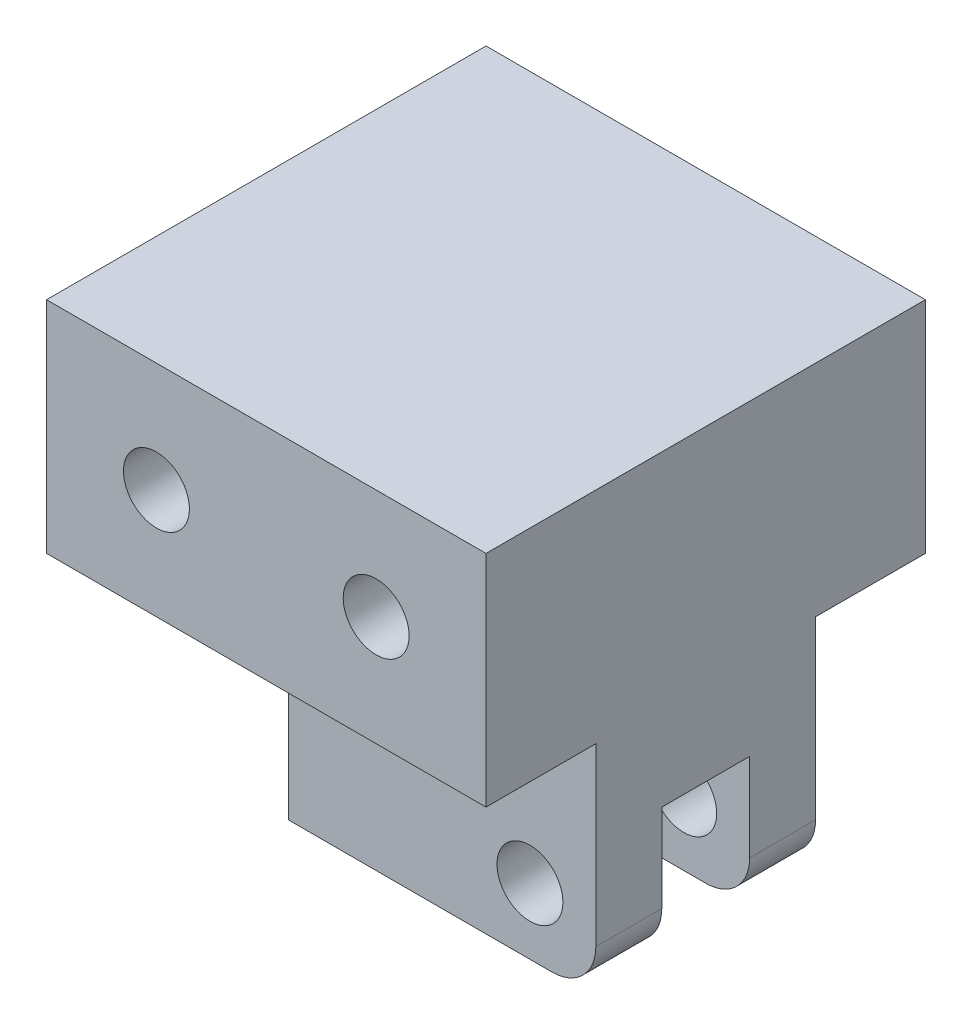
ISO-10303-21;
HEADER;
FILE_DESCRIPTION(('STEP AP214'),'2;1');
FILE_NAME('part.step','',(''),(''),'','','');
FILE_SCHEMA(('AUTOMOTIVE_DESIGN { 1 0 10303 214 1 1 1 1 }'));
ENDSEC;
DATA;
#1=APPLICATION_CONTEXT('core data for automotive mechanical design processes');
#2=APPLICATION_PROTOCOL_DEFINITION('international standard','automotive_design',2000,#1);
#3=PRODUCT_CONTEXT('',#1,'mechanical');
#4=PRODUCT('Part','Part','',(#3));
#5=PRODUCT_RELATED_PRODUCT_CATEGORY('part','',(#4));
#6=PRODUCT_DEFINITION_FORMATION('','',#4);
#7=PRODUCT_DEFINITION_CONTEXT('part definition',#1,'design');
#8=PRODUCT_DEFINITION('design','',#6,#7);
#9=PRODUCT_DEFINITION_SHAPE('','',#8);
#10=(LENGTH_UNIT() NAMED_UNIT(*) SI_UNIT(.MILLI.,.METRE.));
#11=(NAMED_UNIT(*) PLANE_ANGLE_UNIT() SI_UNIT($,.RADIAN.));
#12=(NAMED_UNIT(*) SI_UNIT($,.STERADIAN.) SOLID_ANGLE_UNIT());
#13=UNCERTAINTY_MEASURE_WITH_UNIT(LENGTH_MEASURE(1.E-05),#10,'distance_accuracy_value','');
#14=(GEOMETRIC_REPRESENTATION_CONTEXT(3) GLOBAL_UNCERTAINTY_ASSIGNED_CONTEXT((#13)) GLOBAL_UNIT_ASSIGNED_CONTEXT((#10,
#11,#12)) REPRESENTATION_CONTEXT('',''));
#15=CARTESIAN_POINT('',(0.,0.,0.));
#16=DIRECTION('',(0.,0.,1.));
#17=DIRECTION('',(1.,0.,0.));
#18=AXIS2_PLACEMENT_3D('',#15,#16,#17);
#19=CARTESIAN_POINT('',(85.,-35.,0.));
#20=DIRECTION('',(0.,0.,1.));
#21=DIRECTION('',(1.,0.,0.));
#22=AXIS2_PLACEMENT_3D('',#19,#20,#21);
#23=CYLINDRICAL_SURFACE('',#22,7.50000000000001);
#24=CARTESIAN_POINT('',(85.,-35.,40.));
#25=DIRECTION('',(0.,0.,-1.));
#26=DIRECTION('',(-1.,0.,0.));
#27=AXIS2_PLACEMENT_3D('',#24,#25,#26);
#28=CIRCLE('',#27,7.50000000000001);
#29=CARTESIAN_POINT('',(77.5,-35.,40.));
#30=VERTEX_POINT('',#29);
#31=EDGE_CURVE('E192',#30,#30,#28,.F.);
#32=ORIENTED_EDGE('',*,*,#31,.T.);
#33=EDGE_LOOP('',(#32));
#34=FACE_BOUND('',#33,.T.);
#35=CARTESIAN_POINT('',(85.,-35.,25.));
#36=DIRECTION('',(0.,0.,1.));
#37=DIRECTION('',(1.,0.,0.));
#38=AXIS2_PLACEMENT_3D('',#35,#36,#37);
#39=CIRCLE('',#38,7.50000000000001);
#40=CARTESIAN_POINT('',(92.5,-35.,25.));
#41=VERTEX_POINT('',#40);
#42=EDGE_CURVE('E191',#41,#41,#39,.T.);
#43=ORIENTED_EDGE('',*,*,#42,.F.);
#44=EDGE_LOOP('',(#43));
#45=FACE_BOUND('',#44,.T.);
#46=ADVANCED_FACE('F45',(#34,#45),#23,.F.);
#47=CARTESIAN_POINT('',(100.,0.,0.));
#48=DIRECTION('',(0.,1.,0.));
#49=DIRECTION('',(0.,0.,1.));
#50=AXIS2_PLACEMENT_3D('',#47,#48,#49);
#51=PLANE('',#50);
#52=DIRECTION('',(1.,0.,0.));
#53=VECTOR('',#52,1.);
#54=CARTESIAN_POINT('',(100.,0.,25.));
#55=LINE('',#54,#53);
#56=CARTESIAN_POINT('',(30.,0.,25.));
#57=VERTEX_POINT('',#56);
#58=CARTESIAN_POINT('',(100.,0.,25.));
#59=VERTEX_POINT('',#58);
#60=EDGE_CURVE('E197',#57,#59,#55,.T.);
#61=ORIENTED_EDGE('',*,*,#60,.F.);
#62=DIRECTION('',(0.,0.,-1.));
#63=VECTOR('',#62,1.);
#64=CARTESIAN_POINT('',(30.,0.,75.));
#65=LINE('',#64,#63);
#66=CARTESIAN_POINT('',(30.,0.,75.));
#67=VERTEX_POINT('',#66);
#68=EDGE_CURVE('E209',#67,#57,#65,.T.);
#69=ORIENTED_EDGE('',*,*,#68,.F.);
#70=DIRECTION('',(-1.,0.,0.));
#71=VECTOR('',#70,1.);
#72=CARTESIAN_POINT('',(100.,0.,75.));
#73=LINE('',#72,#71);
#74=CARTESIAN_POINT('',(100.,0.,75.));
#75=VERTEX_POINT('',#74);
#76=EDGE_CURVE('E205',#75,#67,#73,.T.);
#77=ORIENTED_EDGE('',*,*,#76,.F.);
#78=DIRECTION('',(0.,0.,-1.));
#79=VECTOR('',#78,1.);
#80=CARTESIAN_POINT('',(100.,0.,0.));
#81=LINE('',#80,#79);
#82=CARTESIAN_POINT('',(100.,0.,100.));
#83=VERTEX_POINT('',#82);
#84=EDGE_CURVE('E258',#83,#75,#81,.T.);
#85=ORIENTED_EDGE('',*,*,#84,.F.);
#86=DIRECTION('',(-1.,0.,0.));
#87=VECTOR('',#86,1.);
#88=CARTESIAN_POINT('',(100.,0.,100.));
#89=LINE('',#88,#87);
#90=CARTESIAN_POINT('',(0.,0.,100.));
#91=VERTEX_POINT('',#90);
#92=EDGE_CURVE('E277',#83,#91,#89,.T.);
#93=ORIENTED_EDGE('',*,*,#92,.T.);
#94=DIRECTION('',(0.,0.,-1.));
#95=VECTOR('',#94,1.);
#96=CARTESIAN_POINT('',(0.,0.,0.));
#97=LINE('',#96,#95);
#98=CARTESIAN_POINT('',(0.,0.,0.));
#99=VERTEX_POINT('',#98);
#100=EDGE_CURVE('E251',#91,#99,#97,.T.);
#101=ORIENTED_EDGE('',*,*,#100,.T.);
#102=DIRECTION('',(-1.,0.,0.));
#103=VECTOR('',#102,1.);
#104=CARTESIAN_POINT('',(100.,0.,0.));
#105=LINE('',#104,#103);
#106=CARTESIAN_POINT('',(100.,0.,0.));
#107=VERTEX_POINT('',#106);
#108=EDGE_CURVE('E262',#107,#99,#105,.T.);
#109=ORIENTED_EDGE('',*,*,#108,.F.);
#110=EDGE_CURVE('E257',#59,#107,#81,.T.);
#111=ORIENTED_EDGE('',*,*,#110,.F.);
#112=EDGE_LOOP('',(#61,#69,#77,#85,#93,#101,#109,#111));
#113=FACE_BOUND('',#112,.T.);
#114=ADVANCED_FACE('F364',(#113),#51,.F.);
#115=CARTESIAN_POINT('',(100.,0.,0.));
#116=DIRECTION('',(0.,0.,1.));
#117=DIRECTION('',(0.,-1.,0.));
#118=AXIS2_PLACEMENT_3D('',#115,#116,#117);
#119=PLANE('',#118);
#120=CARTESIAN_POINT('',(75.,25.,0.));
#121=DIRECTION('',(0.,0.,-1.));
#122=DIRECTION('',(0.,1.,0.));
#123=AXIS2_PLACEMENT_3D('',#120,#121,#122);
#124=CIRCLE('',#123,7.5);
#125=CARTESIAN_POINT('',(75.,32.5,0.));
#126=VERTEX_POINT('',#125);
#127=EDGE_CURVE('E235',#126,#126,#124,.T.);
#128=ORIENTED_EDGE('',*,*,#127,.F.);
#129=EDGE_LOOP('',(#128));
#130=FACE_BOUND('',#129,.T.);
#131=CARTESIAN_POINT('',(25.,25.,0.));
#132=DIRECTION('',(0.,0.,-1.));
#133=DIRECTION('',(0.,1.,0.));
#134=AXIS2_PLACEMENT_3D('',#131,#132,#133);
#135=CIRCLE('',#134,7.5);
#136=CARTESIAN_POINT('',(25.,32.5,0.));
#137=VERTEX_POINT('',#136);
#138=EDGE_CURVE('E239',#137,#137,#135,.T.);
#139=ORIENTED_EDGE('',*,*,#138,.F.);
#140=EDGE_LOOP('',(#139));
#141=FACE_BOUND('',#140,.T.);
#142=DIRECTION('',(0.,1.,0.));
#143=VECTOR('',#142,1.);
#144=CARTESIAN_POINT('',(0.,0.,0.));
#145=LINE('',#144,#143);
#146=CARTESIAN_POINT('',(0.,50.,0.));
#147=VERTEX_POINT('',#146);
#148=EDGE_CURVE('E234',#99,#147,#145,.T.);
#149=ORIENTED_EDGE('',*,*,#148,.T.);
#150=DIRECTION('',(-1.,0.,0.));
#151=VECTOR('',#150,1.);
#152=CARTESIAN_POINT('',(100.,50.,0.));
#153=LINE('',#152,#151);
#154=CARTESIAN_POINT('',(100.,50.,0.));
#155=VERTEX_POINT('',#154);
#156=EDGE_CURVE('E285',#155,#147,#153,.T.);
#157=ORIENTED_EDGE('',*,*,#156,.F.);
#158=DIRECTION('',(0.,1.,0.));
#159=VECTOR('',#158,1.);
#160=CARTESIAN_POINT('',(100.,0.,0.));
#161=LINE('',#160,#159);
#162=EDGE_CURVE('E246',#107,#155,#161,.T.);
#163=ORIENTED_EDGE('',*,*,#162,.F.);
#164=ORIENTED_EDGE('',*,*,#108,.T.);
#165=EDGE_LOOP('',(#149,#157,#163,#164));
#166=FACE_BOUND('',#165,.T.);
#167=ADVANCED_FACE('F373',(#130,#141,#166),#119,.F.);
#168=CARTESIAN_POINT('',(100.,50.,0.));
#169=DIRECTION('',(0.,-1.,0.));
#170=DIRECTION('',(0.,0.,-1.));
#171=AXIS2_PLACEMENT_3D('',#168,#169,#170);
#172=PLANE('',#171);
#173=DIRECTION('',(0.,0.,1.));
#174=VECTOR('',#173,1.);
#175=CARTESIAN_POINT('',(0.,50.,0.));
#176=LINE('',#175,#174);
#177=CARTESIAN_POINT('',(0.,50.,100.));
#178=VERTEX_POINT('',#177);
#179=EDGE_CURVE('E266',#147,#178,#176,.T.);
#180=ORIENTED_EDGE('',*,*,#179,.T.);
#181=DIRECTION('',(-1.,0.,0.));
#182=VECTOR('',#181,1.);
#183=CARTESIAN_POINT('',(100.,50.,100.));
#184=LINE('',#183,#182);
#185=CARTESIAN_POINT('',(100.,50.,100.));
#186=VERTEX_POINT('',#185);
#187=EDGE_CURVE('E281',#186,#178,#184,.T.);
#188=ORIENTED_EDGE('',*,*,#187,.F.);
#189=DIRECTION('',(0.,0.,1.));
#190=VECTOR('',#189,1.);
#191=CARTESIAN_POINT('',(100.,50.,0.));
#192=LINE('',#191,#190);
#193=EDGE_CURVE('E250',#155,#186,#192,.T.);
#194=ORIENTED_EDGE('',*,*,#193,.F.);
#195=ORIENTED_EDGE('',*,*,#156,.T.);
#196=EDGE_LOOP('',(#180,#188,#194,#195));
#197=FACE_BOUND('',#196,.T.);
#198=ADVANCED_FACE('F420',(#197),#172,.F.);
#199=CARTESIAN_POINT('',(100.,0.,100.));
#200=DIRECTION('',(0.,0.,-1.));
#201=DIRECTION('',(-1.,0.,0.));
#202=AXIS2_PLACEMENT_3D('',#199,#200,#201);
#203=PLANE('',#202);
#204=CARTESIAN_POINT('',(75.,25.,100.));
#205=DIRECTION('',(0.,0.,-1.));
#206=DIRECTION('',(0.,1.,0.));
#207=AXIS2_PLACEMENT_3D('',#204,#205,#206);
#208=CIRCLE('',#207,7.5);
#209=CARTESIAN_POINT('',(75.,32.5,100.));
#210=VERTEX_POINT('',#209);
#211=EDGE_CURVE('E230',#210,#210,#208,.T.);
#212=ORIENTED_EDGE('',*,*,#211,.T.);
#213=EDGE_LOOP('',(#212));
#214=FACE_BOUND('',#213,.T.);
#215=CARTESIAN_POINT('',(25.,25.,100.));
#216=DIRECTION('',(0.,0.,-1.));
#217=DIRECTION('',(0.,1.,0.));
#218=AXIS2_PLACEMENT_3D('',#215,#216,#217);
#219=CIRCLE('',#218,7.5);
#220=CARTESIAN_POINT('',(25.,32.5,100.));
#221=VERTEX_POINT('',#220);
#222=EDGE_CURVE('E229',#221,#221,#219,.T.);
#223=ORIENTED_EDGE('',*,*,#222,.T.);
#224=EDGE_LOOP('',(#223));
#225=FACE_BOUND('',#224,.T.);
#226=DIRECTION('',(0.,-1.,0.));
#227=VECTOR('',#226,1.);
#228=CARTESIAN_POINT('',(0.,0.,100.));
#229=LINE('',#228,#227);
#230=EDGE_CURVE('E269',#178,#91,#229,.T.);
#231=ORIENTED_EDGE('',*,*,#230,.T.);
#232=ORIENTED_EDGE('',*,*,#92,.F.);
#233=DIRECTION('',(0.,-1.,0.));
#234=VECTOR('',#233,1.);
#235=CARTESIAN_POINT('',(100.,0.,100.));
#236=LINE('',#235,#234);
#237=EDGE_CURVE('E254',#186,#83,#236,.T.);
#238=ORIENTED_EDGE('',*,*,#237,.F.);
#239=ORIENTED_EDGE('',*,*,#187,.T.);
#240=EDGE_LOOP('',(#231,#232,#238,#239));
#241=FACE_BOUND('',#240,.T.);
#242=ADVANCED_FACE('F423',(#214,#225,#241),#203,.F.);
#243=CARTESIAN_POINT('',(100.,0.,0.));
#244=DIRECTION('',(1.,0.,0.));
#245=DIRECTION('',(0.,0.,-1.));
#246=AXIS2_PLACEMENT_3D('',#243,#244,#245);
#247=PLANE('',#246);
#248=DIRECTION('',(0.,-1.,0.));
#249=VECTOR('',#248,1.);
#250=CARTESIAN_POINT('',(100.,-20.,40.));
#251=LINE('',#250,#249);
#252=CARTESIAN_POINT('',(100.,-20.,40.));
#253=VERTEX_POINT('',#252);
#254=CARTESIAN_POINT('',(100.,-40.,40.));
#255=VERTEX_POINT('',#254);
#256=EDGE_CURVE('E297',#253,#255,#251,.T.);
#257=ORIENTED_EDGE('',*,*,#256,.T.);
#258=DIRECTION('',(0.,0.,1.));
#259=VECTOR('',#258,1.);
#260=CARTESIAN_POINT('',(100.,-40.,25.));
#261=LINE('',#260,#259);
#262=CARTESIAN_POINT('',(100.,-40.,25.));
#263=VERTEX_POINT('',#262);
#264=EDGE_CURVE('E316',#255,#263,#261,.F.);
#265=ORIENTED_EDGE('',*,*,#264,.T.);
#266=DIRECTION('',(0.,1.,0.));
#267=VECTOR('',#266,1.);
#268=CARTESIAN_POINT('',(100.,-50.,25.));
#269=LINE('',#268,#267);
#270=EDGE_CURVE('E204',#263,#59,#269,.T.);
#271=ORIENTED_EDGE('',*,*,#270,.T.);
#272=ORIENTED_EDGE('',*,*,#110,.T.);
#273=ORIENTED_EDGE('',*,*,#162,.T.);
#274=ORIENTED_EDGE('',*,*,#193,.T.);
#275=ORIENTED_EDGE('',*,*,#237,.T.);
#276=ORIENTED_EDGE('',*,*,#84,.T.);
#277=DIRECTION('',(0.,1.,0.));
#278=VECTOR('',#277,1.);
#279=CARTESIAN_POINT('',(100.,-50.,75.));
#280=LINE('',#279,#278);
#281=CARTESIAN_POINT('',(100.,-40.,75.));
#282=VERTEX_POINT('',#281);
#283=EDGE_CURVE('E226',#282,#75,#280,.T.);
#284=ORIENTED_EDGE('',*,*,#283,.F.);
#285=DIRECTION('',(0.,0.,1.));
#286=VECTOR('',#285,1.);
#287=CARTESIAN_POINT('',(100.,-40.,60.));
#288=LINE('',#287,#286);
#289=CARTESIAN_POINT('',(100.,-40.,60.));
#290=VERTEX_POINT('',#289);
#291=EDGE_CURVE('E176',#282,#290,#288,.F.);
#292=ORIENTED_EDGE('',*,*,#291,.T.);
#293=DIRECTION('',(0.,-1.,0.));
#294=VECTOR('',#293,1.);
#295=CARTESIAN_POINT('',(100.,-20.,60.));
#296=LINE('',#295,#294);
#297=CARTESIAN_POINT('',(100.,-20.,60.));
#298=VERTEX_POINT('',#297);
#299=EDGE_CURVE('E155',#298,#290,#296,.T.);
#300=ORIENTED_EDGE('',*,*,#299,.F.);
#301=DIRECTION('',(0.,0.,1.));
#302=VECTOR('',#301,1.);
#303=CARTESIAN_POINT('',(100.,-20.,60.));
#304=LINE('',#303,#302);
#305=EDGE_CURVE('E162',#253,#298,#304,.T.);
#306=ORIENTED_EDGE('',*,*,#305,.F.);
#307=EDGE_LOOP('',(#257,#265,#271,#272,#273,#274,#275,#276,#284,#292,#300,#306));
#308=FACE_BOUND('',#307,.T.);
#309=ADVANCED_FACE('F173',(#308),#247,.T.);
#310=CARTESIAN_POINT('',(0.,0.,0.));
#311=DIRECTION('',(1.,0.,0.));
#312=DIRECTION('',(0.,0.,-1.));
#313=AXIS2_PLACEMENT_3D('',#310,#311,#312);
#314=PLANE('',#313);
#315=ORIENTED_EDGE('',*,*,#148,.F.);
#316=ORIENTED_EDGE('',*,*,#100,.F.);
#317=ORIENTED_EDGE('',*,*,#230,.F.);
#318=ORIENTED_EDGE('',*,*,#179,.F.);
#319=EDGE_LOOP('',(#315,#316,#317,#318));
#320=FACE_BOUND('',#319,.T.);
#321=ADVANCED_FACE('F427',(#320),#314,.F.);
#322=CARTESIAN_POINT('',(25.,25.,100.));
#323=DIRECTION('',(0.,0.,-1.));
#324=DIRECTION('',(0.,1.,0.));
#325=AXIS2_PLACEMENT_3D('',#322,#323,#324);
#326=CYLINDRICAL_SURFACE('',#325,7.5);
#327=CARTESIAN_POINT('',(25.,32.5,100.));
#328=CARTESIAN_POINT('',(25.,32.5,98.9583333333333));
#329=CARTESIAN_POINT('',(25.,32.5,97.9166666666667));
#330=CARTESIAN_POINT('',(25.,32.5,95.8333333333333));
#331=CARTESIAN_POINT('',(25.,32.5,94.7916666666667));
#332=CARTESIAN_POINT('',(25.,32.5,92.7083333333333));
#333=CARTESIAN_POINT('',(25.,32.5,91.6666666666667));
#334=CARTESIAN_POINT('',(25.,32.5,89.5833333333333));
#335=CARTESIAN_POINT('',(25.,32.5,88.5416666666667));
#336=CARTESIAN_POINT('',(25.,32.5,86.4583333333333));
#337=CARTESIAN_POINT('',(25.,32.5,85.4166666666667));
#338=CARTESIAN_POINT('',(25.,32.5,83.3333333333333));
#339=CARTESIAN_POINT('',(25.,32.5,82.2916666666667));
#340=CARTESIAN_POINT('',(25.,32.5,80.2083333333333));
#341=CARTESIAN_POINT('',(25.,32.5,79.1666666666667));
#342=CARTESIAN_POINT('',(25.,32.5,77.0833333333333));
#343=CARTESIAN_POINT('',(25.,32.5,76.0416666666667));
#344=CARTESIAN_POINT('',(25.,32.5,73.9583333333333));
#345=CARTESIAN_POINT('',(25.,32.5,72.9166666666667));
#346=CARTESIAN_POINT('',(25.,32.5,70.8333333333333));
#347=CARTESIAN_POINT('',(25.,32.5,69.7916666666667));
#348=CARTESIAN_POINT('',(25.,32.5,67.7083333333333));
#349=CARTESIAN_POINT('',(25.,32.5,66.6666666666667));
#350=CARTESIAN_POINT('',(25.,32.5,64.5833333333333));
#351=CARTESIAN_POINT('',(25.,32.5,63.5416666666667));
#352=CARTESIAN_POINT('',(25.,32.5,61.4583333333333));
#353=CARTESIAN_POINT('',(25.,32.5,60.4166666666667));
#354=CARTESIAN_POINT('',(25.,32.5,58.3333333333333));
#355=CARTESIAN_POINT('',(25.,32.5,57.2916666666667));
#356=CARTESIAN_POINT('',(25.,32.5,55.2083333333333));
#357=CARTESIAN_POINT('',(25.,32.5,54.1666666666667));
#358=CARTESIAN_POINT('',(25.,32.5,52.0833333333333));
#359=CARTESIAN_POINT('',(25.,32.5,51.0416666666667));
#360=CARTESIAN_POINT('',(25.,32.5,48.9583333333333));
#361=CARTESIAN_POINT('',(25.,32.5,47.9166666666667));
#362=CARTESIAN_POINT('',(25.,32.5,45.8333333333333));
#363=CARTESIAN_POINT('',(25.,32.5,44.7916666666667));
#364=CARTESIAN_POINT('',(25.,32.5,42.7083333333333));
#365=CARTESIAN_POINT('',(25.,32.5,41.6666666666667));
#366=CARTESIAN_POINT('',(25.,32.5,39.5833333333333));
#367=CARTESIAN_POINT('',(25.,32.5,38.5416666666667));
#368=CARTESIAN_POINT('',(25.,32.5,36.4583333333333));
#369=CARTESIAN_POINT('',(25.,32.5,35.4166666666667));
#370=CARTESIAN_POINT('',(25.,32.5,33.3333333333333));
#371=CARTESIAN_POINT('',(25.,32.5,32.2916666666667));
#372=CARTESIAN_POINT('',(25.,32.5,30.2083333333333));
#373=CARTESIAN_POINT('',(25.,32.5,29.1666666666667));
#374=CARTESIAN_POINT('',(25.,32.5,27.0833333333333));
#375=CARTESIAN_POINT('',(25.,32.5,26.0416666666667));
#376=CARTESIAN_POINT('',(25.,32.5,23.9583333333333));
#377=CARTESIAN_POINT('',(25.,32.5,22.9166666666667));
#378=CARTESIAN_POINT('',(25.,32.5,20.8333333333333));
#379=CARTESIAN_POINT('',(25.,32.5,19.7916666666667));
#380=CARTESIAN_POINT('',(25.,32.5,17.7083333333333));
#381=CARTESIAN_POINT('',(25.,32.5,16.6666666666667));
#382=CARTESIAN_POINT('',(25.,32.5,14.5833333333333));
#383=CARTESIAN_POINT('',(25.,32.5,13.5416666666667));
#384=CARTESIAN_POINT('',(25.,32.5,11.4583333333333));
#385=CARTESIAN_POINT('',(25.,32.5,10.4166666666667));
#386=CARTESIAN_POINT('',(25.,32.5,8.33333333333333));
#387=CARTESIAN_POINT('',(25.,32.5,7.29166666666667));
#388=CARTESIAN_POINT('',(25.,32.5,5.20833333333334));
#389=CARTESIAN_POINT('',(25.,32.5,4.16666666666667));
#390=CARTESIAN_POINT('',(25.,32.5,2.08333333333334));
#391=CARTESIAN_POINT('',(25.,32.5,1.04166666666667));
#392=CARTESIAN_POINT('',(25.,32.5,0.));
#393=B_SPLINE_CURVE_WITH_KNOTS('',3,(#327,#328,#329,#330,#331,#332,#333,#334,#335,#336,#337,
#338,#339,#340,#341,#342,#343,#344,#345,#346,#347,#348,#349,#350,#351,#352,#353,#354,#355,#356,
#357,#358,#359,#360,#361,#362,#363,#364,#365,#366,#367,#368,#369,#370,#371,#372,#373,#374,#375,
#376,#377,#378,#379,#380,#381,#382,#383,#384,#385,#386,#387,#388,#389,#390,#391,#392),
.UNSPECIFIED.,.F.,.F.,(4,2,2,2,2,2,2,2,2,2,2,2,2,2,2,2,2,2,2,2,2,2,2,2,2,2,2,2,2,2,2,2,4),(0.,
3.12499999999999,6.24999999999999,9.37499999999999,12.5,15.625,18.75,21.875,25.,28.125,31.25,
34.375,37.5,40.625,43.75,46.875,50.,53.125,56.25,59.375,62.5,65.625,68.75,71.875,75.,78.125,
81.25,84.375,87.5,90.625,93.75,96.875,100.),.UNSPECIFIED.);
#394=EDGE_CURVE('BSEAM429',#221,#137,#393,.T.);
#395=ORIENTED_EDGE('',*,*,#222,.F.);
#396=ORIENTED_EDGE('',*,*,#138,.T.);
#397=ORIENTED_EDGE('',*,*,#394,.T.);
#398=ORIENTED_EDGE('',*,*,#394,.F.);
#399=EDGE_LOOP('',(#395,#397,#396,#398));
#400=FACE_BOUND('',#399,.T.);
#401=ADVANCED_FACE('F429',(#400),#326,.F.);
#402=CARTESIAN_POINT('',(75.,25.,100.));
#403=DIRECTION('',(0.,0.,-1.));
#404=DIRECTION('',(0.,1.,0.));
#405=AXIS2_PLACEMENT_3D('',#402,#403,#404);
#406=CYLINDRICAL_SURFACE('',#405,7.5);
#407=CARTESIAN_POINT('',(75.,32.5,100.));
#408=CARTESIAN_POINT('',(75.,32.5,98.9583333333333));
#409=CARTESIAN_POINT('',(75.,32.5,97.9166666666667));
#410=CARTESIAN_POINT('',(75.,32.5,95.8333333333333));
#411=CARTESIAN_POINT('',(75.,32.5,94.7916666666667));
#412=CARTESIAN_POINT('',(75.,32.5,92.7083333333333));
#413=CARTESIAN_POINT('',(75.,32.5,91.6666666666667));
#414=CARTESIAN_POINT('',(75.,32.5,89.5833333333333));
#415=CARTESIAN_POINT('',(75.,32.5,88.5416666666667));
#416=CARTESIAN_POINT('',(75.,32.5,86.4583333333333));
#417=CARTESIAN_POINT('',(75.,32.5,85.4166666666667));
#418=CARTESIAN_POINT('',(75.,32.5,83.3333333333333));
#419=CARTESIAN_POINT('',(75.,32.5,82.2916666666667));
#420=CARTESIAN_POINT('',(75.,32.5,80.2083333333333));
#421=CARTESIAN_POINT('',(75.,32.5,79.1666666666667));
#422=CARTESIAN_POINT('',(75.,32.5,77.0833333333333));
#423=CARTESIAN_POINT('',(75.,32.5,76.0416666666667));
#424=CARTESIAN_POINT('',(75.,32.5,73.9583333333333));
#425=CARTESIAN_POINT('',(75.,32.5,72.9166666666667));
#426=CARTESIAN_POINT('',(75.,32.5,70.8333333333333));
#427=CARTESIAN_POINT('',(75.,32.5,69.7916666666667));
#428=CARTESIAN_POINT('',(75.,32.5,67.7083333333333));
#429=CARTESIAN_POINT('',(75.,32.5,66.6666666666667));
#430=CARTESIAN_POINT('',(75.,32.5,64.5833333333333));
#431=CARTESIAN_POINT('',(75.,32.5,63.5416666666667));
#432=CARTESIAN_POINT('',(75.,32.5,61.4583333333333));
#433=CARTESIAN_POINT('',(75.,32.5,60.4166666666667));
#434=CARTESIAN_POINT('',(75.,32.5,58.3333333333333));
#435=CARTESIAN_POINT('',(75.,32.5,57.2916666666667));
#436=CARTESIAN_POINT('',(75.,32.5,55.2083333333333));
#437=CARTESIAN_POINT('',(75.,32.5,54.1666666666667));
#438=CARTESIAN_POINT('',(75.,32.5,52.0833333333333));
#439=CARTESIAN_POINT('',(75.,32.5,51.0416666666667));
#440=CARTESIAN_POINT('',(75.,32.5,48.9583333333333));
#441=CARTESIAN_POINT('',(75.,32.5,47.9166666666667));
#442=CARTESIAN_POINT('',(75.,32.5,45.8333333333333));
#443=CARTESIAN_POINT('',(75.,32.5,44.7916666666667));
#444=CARTESIAN_POINT('',(75.,32.5,42.7083333333333));
#445=CARTESIAN_POINT('',(75.,32.5,41.6666666666667));
#446=CARTESIAN_POINT('',(75.,32.5,39.5833333333333));
#447=CARTESIAN_POINT('',(75.,32.5,38.5416666666667));
#448=CARTESIAN_POINT('',(75.,32.5,36.4583333333333));
#449=CARTESIAN_POINT('',(75.,32.5,35.4166666666667));
#450=CARTESIAN_POINT('',(75.,32.5,33.3333333333333));
#451=CARTESIAN_POINT('',(75.,32.5,32.2916666666667));
#452=CARTESIAN_POINT('',(75.,32.5,30.2083333333333));
#453=CARTESIAN_POINT('',(75.,32.5,29.1666666666667));
#454=CARTESIAN_POINT('',(75.,32.5,27.0833333333333));
#455=CARTESIAN_POINT('',(75.,32.5,26.0416666666667));
#456=CARTESIAN_POINT('',(75.,32.5,23.9583333333333));
#457=CARTESIAN_POINT('',(75.,32.5,22.9166666666667));
#458=CARTESIAN_POINT('',(75.,32.5,20.8333333333333));
#459=CARTESIAN_POINT('',(75.,32.5,19.7916666666667));
#460=CARTESIAN_POINT('',(75.,32.5,17.7083333333333));
#461=CARTESIAN_POINT('',(75.,32.5,16.6666666666667));
#462=CARTESIAN_POINT('',(75.,32.5,14.5833333333333));
#463=CARTESIAN_POINT('',(75.,32.5,13.5416666666667));
#464=CARTESIAN_POINT('',(75.,32.5,11.4583333333333));
#465=CARTESIAN_POINT('',(75.,32.5,10.4166666666667));
#466=CARTESIAN_POINT('',(75.,32.5,8.33333333333333));
#467=CARTESIAN_POINT('',(75.,32.5,7.29166666666667));
#468=CARTESIAN_POINT('',(75.,32.5,5.20833333333334));
#469=CARTESIAN_POINT('',(75.,32.5,4.16666666666667));
#470=CARTESIAN_POINT('',(75.,32.5,2.08333333333334));
#471=CARTESIAN_POINT('',(75.,32.5,1.04166666666667));
#472=CARTESIAN_POINT('',(75.,32.5,0.));
#473=B_SPLINE_CURVE_WITH_KNOTS('',3,(#407,#408,#409,#410,#411,#412,#413,#414,#415,#416,#417,
#418,#419,#420,#421,#422,#423,#424,#425,#426,#427,#428,#429,#430,#431,#432,#433,#434,#435,#436,
#437,#438,#439,#440,#441,#442,#443,#444,#445,#446,#447,#448,#449,#450,#451,#452,#453,#454,#455,
#456,#457,#458,#459,#460,#461,#462,#463,#464,#465,#466,#467,#468,#469,#470,#471,#472),
.UNSPECIFIED.,.F.,.F.,(4,2,2,2,2,2,2,2,2,2,2,2,2,2,2,2,2,2,2,2,2,2,2,2,2,2,2,2,2,2,2,2,4),(0.,
3.12499999999999,6.24999999999999,9.37499999999999,12.5,15.625,18.75,21.875,25.,28.125,31.25,
34.375,37.5,40.625,43.75,46.875,50.,53.125,56.25,59.375,62.5,65.625,68.75,71.875,75.,78.125,
81.25,84.375,87.5,90.625,93.75,96.875,100.),.UNSPECIFIED.);
#474=EDGE_CURVE('BSEAM395',#210,#126,#473,.T.);
#475=ORIENTED_EDGE('',*,*,#211,.F.);
#476=ORIENTED_EDGE('',*,*,#127,.T.);
#477=ORIENTED_EDGE('',*,*,#474,.T.);
#478=ORIENTED_EDGE('',*,*,#474,.F.);
#479=EDGE_LOOP('',(#475,#477,#476,#478));
#480=FACE_BOUND('',#479,.T.);
#481=ADVANCED_FACE('F395',(#480),#406,.F.);
#482=CARTESIAN_POINT('',(100.,-50.,75.));
#483=DIRECTION('',(0.,0.,-1.));
#484=DIRECTION('',(-1.,0.,0.));
#485=AXIS2_PLACEMENT_3D('',#482,#483,#484);
#486=PLANE('',#485);
#487=CARTESIAN_POINT('',(85.,-35.,75.));
#488=DIRECTION('',(0.,0.,1.));
#489=DIRECTION('',(1.,0.,0.));
#490=AXIS2_PLACEMENT_3D('',#487,#488,#489);
#491=CIRCLE('',#490,7.50000000000001);
#492=CARTESIAN_POINT('',(92.5,-35.,75.));
#493=VERTEX_POINT('',#492);
#494=EDGE_CURVE('E187',#493,#493,#491,.T.);
#495=ORIENTED_EDGE('',*,*,#494,.F.);
#496=EDGE_LOOP('',(#495));
#497=FACE_BOUND('',#496,.T.);
#498=DIRECTION('',(-1.,0.,0.));
#499=VECTOR('',#498,1.);
#500=CARTESIAN_POINT('',(100.,-50.,75.));
#501=LINE('',#500,#499);
#502=CARTESIAN_POINT('',(90.,-50.,75.));
#503=VERTEX_POINT('',#502);
#504=CARTESIAN_POINT('',(30.,-50.,75.));
#505=VERTEX_POINT('',#504);
#506=EDGE_CURVE('E193',#503,#505,#501,.T.);
#507=ORIENTED_EDGE('',*,*,#506,.F.);
#508=CARTESIAN_POINT('',(90.,-40.,75.));
#509=DIRECTION('',(0.,0.,-1.));
#510=DIRECTION('',(-1.,0.,0.));
#511=AXIS2_PLACEMENT_3D('',#508,#509,#510);
#512=CIRCLE('',#511,10.);
#513=EDGE_CURVE('E322',#503,#282,#512,.F.);
#514=ORIENTED_EDGE('',*,*,#513,.T.);
#515=ORIENTED_EDGE('',*,*,#283,.T.);
#516=ORIENTED_EDGE('',*,*,#76,.T.);
#517=DIRECTION('',(0.,1.,0.));
#518=VECTOR('',#517,1.);
#519=CARTESIAN_POINT('',(30.,-50.,75.));
#520=LINE('',#519,#518);
#521=EDGE_CURVE('E222',#505,#67,#520,.T.);
#522=ORIENTED_EDGE('',*,*,#521,.F.);
#523=EDGE_LOOP('',(#507,#514,#515,#516,#522));
#524=FACE_BOUND('',#523,.T.);
#525=ADVANCED_FACE('F391',(#497,#524),#486,.F.);
#526=CARTESIAN_POINT('',(30.,-50.,75.));
#527=DIRECTION('',(1.,0.,0.));
#528=DIRECTION('',(0.,0.,-1.));
#529=AXIS2_PLACEMENT_3D('',#526,#527,#528);
#530=PLANE('',#529);
#531=ORIENTED_EDGE('',*,*,#68,.T.);
#532=DIRECTION('',(0.,1.,0.));
#533=VECTOR('',#532,1.);
#534=CARTESIAN_POINT('',(30.,-50.,25.));
#535=LINE('',#534,#533);
#536=CARTESIAN_POINT('',(30.,-50.,25.));
#537=VERTEX_POINT('',#536);
#538=EDGE_CURVE('E218',#537,#57,#535,.T.);
#539=ORIENTED_EDGE('',*,*,#538,.F.);
#540=DIRECTION('',(0.,0.,-1.));
#541=VECTOR('',#540,1.);
#542=CARTESIAN_POINT('',(30.,-50.,75.));
#543=LINE('',#542,#541);
#544=EDGE_CURVE('E196',#505,#537,#543,.T.);
#545=ORIENTED_EDGE('',*,*,#544,.F.);
#546=ORIENTED_EDGE('',*,*,#521,.T.);
#547=EDGE_LOOP('',(#531,#539,#545,#546));
#548=FACE_BOUND('',#547,.T.);
#549=ADVANCED_FACE('F394',(#548),#530,.F.);
#550=CARTESIAN_POINT('',(100.,-50.,25.));
#551=DIRECTION('',(0.,0.,1.));
#552=DIRECTION('',(1.,0.,0.));
#553=AXIS2_PLACEMENT_3D('',#550,#551,#552);
#554=PLANE('',#553);
#555=ORIENTED_EDGE('',*,*,#42,.T.);
#556=EDGE_LOOP('',(#555));
#557=FACE_BOUND('',#556,.T.);
#558=ORIENTED_EDGE('',*,*,#270,.F.);
#559=CARTESIAN_POINT('',(90.,-40.,25.));
#560=DIRECTION('',(0.,0.,1.));
#561=DIRECTION('',(1.,0.,0.));
#562=AXIS2_PLACEMENT_3D('',#559,#560,#561);
#563=CIRCLE('',#562,10.);
#564=CARTESIAN_POINT('',(90.,-50.,25.));
#565=VERTEX_POINT('',#564);
#566=EDGE_CURVE('E319',#263,#565,#563,.F.);
#567=ORIENTED_EDGE('',*,*,#566,.T.);
#568=DIRECTION('',(1.,0.,0.));
#569=VECTOR('',#568,1.);
#570=CARTESIAN_POINT('',(100.,-50.,25.));
#571=LINE('',#570,#569);
#572=EDGE_CURVE('E200',#537,#565,#571,.T.);
#573=ORIENTED_EDGE('',*,*,#572,.F.);
#574=ORIENTED_EDGE('',*,*,#538,.T.);
#575=ORIENTED_EDGE('',*,*,#60,.T.);
#576=EDGE_LOOP('',(#558,#567,#573,#574,#575));
#577=FACE_BOUND('',#576,.T.);
#578=ADVANCED_FACE('F386',(#557,#577),#554,.F.);
#579=CARTESIAN_POINT('',(0.,-50.,0.));
#580=DIRECTION('',(0.,1.,0.));
#581=DIRECTION('',(0.,0.,1.));
#582=AXIS2_PLACEMENT_3D('',#579,#580,#581);
#583=PLANE('',#582);
#584=ORIENTED_EDGE('',*,*,#572,.T.);
#585=DIRECTION('',(0.,0.,1.));
#586=VECTOR('',#585,1.);
#587=CARTESIAN_POINT('',(90.,-50.,40.));
#588=LINE('',#587,#586);
#589=CARTESIAN_POINT('',(90.,-50.,40.));
#590=VERTEX_POINT('',#589);
#591=EDGE_CURVE('E304',#565,#590,#588,.T.);
#592=ORIENTED_EDGE('',*,*,#591,.T.);
#593=DIRECTION('',(1.,0.,0.));
#594=VECTOR('',#593,1.);
#595=CARTESIAN_POINT('',(100.,-50.,40.));
#596=LINE('',#595,#594);
#597=CARTESIAN_POINT('',(70.,-50.,40.));
#598=VERTEX_POINT('',#597);
#599=EDGE_CURVE('E171',#598,#590,#596,.T.);
#600=ORIENTED_EDGE('',*,*,#599,.F.);
#601=DIRECTION('',(0.,0.,-1.));
#602=VECTOR('',#601,1.);
#603=CARTESIAN_POINT('',(70.,-50.,60.));
#604=LINE('',#603,#602);
#605=CARTESIAN_POINT('',(70.,-50.,60.));
#606=VERTEX_POINT('',#605);
#607=EDGE_CURVE('E342',#606,#598,#604,.T.);
#608=ORIENTED_EDGE('',*,*,#607,.F.);
#609=DIRECTION('',(-1.,0.,0.));
#610=VECTOR('',#609,1.);
#611=CARTESIAN_POINT('',(100.,-50.,60.));
#612=LINE('',#611,#610);
#613=CARTESIAN_POINT('',(90.,-50.,60.));
#614=VERTEX_POINT('',#613);
#615=EDGE_CURVE('E346',#614,#606,#612,.T.);
#616=ORIENTED_EDGE('',*,*,#615,.F.);
#617=DIRECTION('',(0.,0.,1.));
#618=VECTOR('',#617,1.);
#619=CARTESIAN_POINT('',(90.,-50.,75.));
#620=LINE('',#619,#618);
#621=EDGE_CURVE('E289',#614,#503,#620,.T.);
#622=ORIENTED_EDGE('',*,*,#621,.T.);
#623=ORIENTED_EDGE('',*,*,#506,.T.);
#624=ORIENTED_EDGE('',*,*,#544,.T.);
#625=EDGE_LOOP('',(#584,#592,#600,#608,#616,#622,#623,#624));
#626=FACE_BOUND('',#625,.T.);
#627=ADVANCED_FACE('F354',(#626),#583,.F.);
#628=CARTESIAN_POINT('',(85.,-35.,60.));
#629=DIRECTION('',(0.,0.,1.));
#630=DIRECTION('',(1.,0.,0.));
#631=AXIS2_PLACEMENT_3D('',#628,#629,#630);
#632=CIRCLE('',#631,7.50000000000001);
#633=CARTESIAN_POINT('',(92.5,-35.,60.));
#634=VERTEX_POINT('',#633);
#635=EDGE_CURVE('E293',#634,#634,#632,.F.);
#636=ORIENTED_EDGE('',*,*,#635,.T.);
#637=EDGE_LOOP('',(#636));
#638=FACE_BOUND('',#637,.T.);
#639=ORIENTED_EDGE('',*,*,#494,.T.);
#640=EDGE_LOOP('',(#639));
#641=FACE_BOUND('',#640,.T.);
#642=ADVANCED_FACE('F367',(#638,#641),#23,.F.);
#643=CARTESIAN_POINT('',(100.,-20.,40.));
#644=DIRECTION('',(0.,0.,-1.));
#645=DIRECTION('',(-1.,0.,0.));
#646=AXIS2_PLACEMENT_3D('',#643,#644,#645);
#647=PLANE('',#646);
#648=ORIENTED_EDGE('',*,*,#599,.T.);
#649=CARTESIAN_POINT('',(90.,-40.,40.));
#650=DIRECTION('',(0.,0.,-1.));
#651=DIRECTION('',(-1.,0.,0.));
#652=AXIS2_PLACEMENT_3D('',#649,#650,#651);
#653=CIRCLE('',#652,10.);
#654=EDGE_CURVE('E311',#590,#255,#653,.F.);
#655=ORIENTED_EDGE('',*,*,#654,.T.);
#656=ORIENTED_EDGE('',*,*,#256,.F.);
#657=DIRECTION('',(1.,0.,0.));
#658=VECTOR('',#657,1.);
#659=CARTESIAN_POINT('',(100.,-20.,40.));
#660=LINE('',#659,#658);
#661=CARTESIAN_POINT('',(80.,-20.,40.));
#662=VERTEX_POINT('',#661);
#663=EDGE_CURVE('E161',#662,#253,#660,.T.);
#664=ORIENTED_EDGE('',*,*,#663,.F.);
#665=CARTESIAN_POINT('',(80.,-30.,40.));
#666=DIRECTION('',(0.,0.,-1.));
#667=DIRECTION('',(-1.,0.,0.));
#668=AXIS2_PLACEMENT_3D('',#665,#666,#667);
#669=CIRCLE('',#668,10.);
#670=CARTESIAN_POINT('',(70.,-30.,40.));
#671=VERTEX_POINT('',#670);
#672=EDGE_CURVE('E308',#662,#671,#669,.F.);
#673=ORIENTED_EDGE('',*,*,#672,.T.);
#674=DIRECTION('',(0.,-1.,0.));
#675=VECTOR('',#674,1.);
#676=CARTESIAN_POINT('',(70.,-20.,40.));
#677=LINE('',#676,#675);
#678=EDGE_CURVE('E182',#671,#598,#677,.T.);
#679=ORIENTED_EDGE('',*,*,#678,.T.);
#680=EDGE_LOOP('',(#648,#655,#656,#664,#673,#679));
#681=FACE_BOUND('',#680,.T.);
#682=ORIENTED_EDGE('',*,*,#31,.F.);
#683=EDGE_LOOP('',(#682));
#684=FACE_BOUND('',#683,.T.);
#685=ADVANCED_FACE('F333',(#681,#684),#647,.F.);
#686=CARTESIAN_POINT('',(100.,-20.,60.));
#687=DIRECTION('',(0.,0.,1.));
#688=DIRECTION('',(1.,0.,0.));
#689=AXIS2_PLACEMENT_3D('',#686,#687,#688);
#690=PLANE('',#689);
#691=ORIENTED_EDGE('',*,*,#299,.T.);
#692=CARTESIAN_POINT('',(90.,-40.,60.));
#693=DIRECTION('',(0.,0.,1.));
#694=DIRECTION('',(1.,0.,0.));
#695=AXIS2_PLACEMENT_3D('',#692,#693,#694);
#696=CIRCLE('',#695,10.);
#697=EDGE_CURVE('E327',#290,#614,#696,.F.);
#698=ORIENTED_EDGE('',*,*,#697,.T.);
#699=ORIENTED_EDGE('',*,*,#615,.T.);
#700=DIRECTION('',(0.,-1.,0.));
#701=VECTOR('',#700,1.);
#702=CARTESIAN_POINT('',(70.,-20.,60.));
#703=LINE('',#702,#701);
#704=CARTESIAN_POINT('',(70.,-30.,60.));
#705=VERTEX_POINT('',#704);
#706=EDGE_CURVE('E178',#705,#606,#703,.T.);
#707=ORIENTED_EDGE('',*,*,#706,.F.);
#708=CARTESIAN_POINT('',(80.,-30.,60.));
#709=DIRECTION('',(0.,0.,1.));
#710=DIRECTION('',(1.,0.,0.));
#711=AXIS2_PLACEMENT_3D('',#708,#709,#710);
#712=CIRCLE('',#711,10.);
#713=CARTESIAN_POINT('',(80.,-20.,60.));
#714=VERTEX_POINT('',#713);
#715=EDGE_CURVE('E61',#705,#714,#712,.F.);
#716=ORIENTED_EDGE('',*,*,#715,.T.);
#717=DIRECTION('',(-1.,0.,0.));
#718=VECTOR('',#717,1.);
#719=CARTESIAN_POINT('',(100.,-20.,60.));
#720=LINE('',#719,#718);
#721=EDGE_CURVE('E150',#298,#714,#720,.T.);
#722=ORIENTED_EDGE('',*,*,#721,.F.);
#723=EDGE_LOOP('',(#691,#698,#699,#707,#716,#722));
#724=FACE_BOUND('',#723,.T.);
#725=ORIENTED_EDGE('',*,*,#635,.F.);
#726=EDGE_LOOP('',(#725));
#727=FACE_BOUND('',#726,.T.);
#728=ADVANCED_FACE('F152',(#724,#727),#690,.F.);
#729=CARTESIAN_POINT('',(70.,-20.,60.));
#730=DIRECTION('',(-1.,0.,0.));
#731=DIRECTION('',(0.,0.,1.));
#732=AXIS2_PLACEMENT_3D('',#729,#730,#731);
#733=PLANE('',#732);
#734=ORIENTED_EDGE('',*,*,#678,.F.);
#735=DIRECTION('',(0.,0.,-1.));
#736=VECTOR('',#735,1.);
#737=CARTESIAN_POINT('',(70.,-30.,60.));
#738=LINE('',#737,#736);
#739=EDGE_CURVE('E11',#671,#705,#738,.F.);
#740=ORIENTED_EDGE('',*,*,#739,.T.);
#741=ORIENTED_EDGE('',*,*,#706,.T.);
#742=ORIENTED_EDGE('',*,*,#607,.T.);
#743=EDGE_LOOP('',(#734,#740,#741,#742));
#744=FACE_BOUND('',#743,.T.);
#745=ADVANCED_FACE('F355',(#744),#733,.F.);
#746=CARTESIAN_POINT('',(0.,-20.,0.));
#747=DIRECTION('',(0.,1.,0.));
#748=DIRECTION('',(0.,0.,1.));
#749=AXIS2_PLACEMENT_3D('',#746,#747,#748);
#750=PLANE('',#749);
#751=ORIENTED_EDGE('',*,*,#721,.T.);
#752=DIRECTION('',(0.,0.,-1.));
#753=VECTOR('',#752,1.);
#754=CARTESIAN_POINT('',(80.,-20.,40.));
#755=LINE('',#754,#753);
#756=EDGE_CURVE('E54',#714,#662,#755,.T.);
#757=ORIENTED_EDGE('',*,*,#756,.T.);
#758=ORIENTED_EDGE('',*,*,#663,.T.);
#759=ORIENTED_EDGE('',*,*,#305,.T.);
#760=EDGE_LOOP('',(#751,#757,#758,#759));
#761=FACE_BOUND('',#760,.T.);
#762=ADVANCED_FACE('F165',(#761),#750,.F.);
#763=CARTESIAN_POINT('',(90.,-40.,0.));
#764=DIRECTION('',(0.,0.,-1.));
#765=DIRECTION('',(-1.,0.,0.));
#766=AXIS2_PLACEMENT_3D('',#763,#764,#765);
#767=CYLINDRICAL_SURFACE('',#766,10.);
#768=ORIENTED_EDGE('',*,*,#566,.F.);
#769=ORIENTED_EDGE('',*,*,#264,.F.);
#770=ORIENTED_EDGE('',*,*,#654,.F.);
#771=ORIENTED_EDGE('',*,*,#591,.F.);
#772=EDGE_LOOP('',(#768,#769,#770,#771));
#773=FACE_BOUND('',#772,.T.);
#774=ADVANCED_FACE('F361',(#773),#767,.T.);
#775=CARTESIAN_POINT('',(90.,-40.,0.));
#776=DIRECTION('',(0.,0.,-1.));
#777=DIRECTION('',(-1.,0.,0.));
#778=AXIS2_PLACEMENT_3D('',#775,#776,#777);
#779=CYLINDRICAL_SURFACE('',#778,10.);
#780=ORIENTED_EDGE('',*,*,#697,.F.);
#781=ORIENTED_EDGE('',*,*,#291,.F.);
#782=ORIENTED_EDGE('',*,*,#513,.F.);
#783=ORIENTED_EDGE('',*,*,#621,.F.);
#784=EDGE_LOOP('',(#780,#781,#782,#783));
#785=FACE_BOUND('',#784,.T.);
#786=ADVANCED_FACE('F357',(#785),#779,.T.);
#787=CARTESIAN_POINT('',(80.,-30.,0.));
#788=DIRECTION('',(0.,0.,1.));
#789=DIRECTION('',(1.,0.,0.));
#790=AXIS2_PLACEMENT_3D('',#787,#788,#789);
#791=CYLINDRICAL_SURFACE('',#790,10.);
#792=ORIENTED_EDGE('',*,*,#715,.F.);
#793=ORIENTED_EDGE('',*,*,#739,.F.);
#794=ORIENTED_EDGE('',*,*,#672,.F.);
#795=ORIENTED_EDGE('',*,*,#756,.F.);
#796=EDGE_LOOP('',(#792,#793,#794,#795));
#797=FACE_BOUND('',#796,.T.);
#798=ADVANCED_FACE('F47',(#797),#791,.F.);
#799=CLOSED_SHELL('',(#46,#114,#167,#198,#242,#309,#321,#401,#481,#525,#549,#578,#627,#642,#685,
#728,#745,#762,#774,#786,#798));
#800=MANIFOLD_SOLID_BREP('B2',#799);
#801=ADVANCED_BREP_SHAPE_REPRESENTATION('',(#18,#800),#14);
#802=SHAPE_DEFINITION_REPRESENTATION(#9,#801);
ENDSEC;
END-ISO-10303-21;
